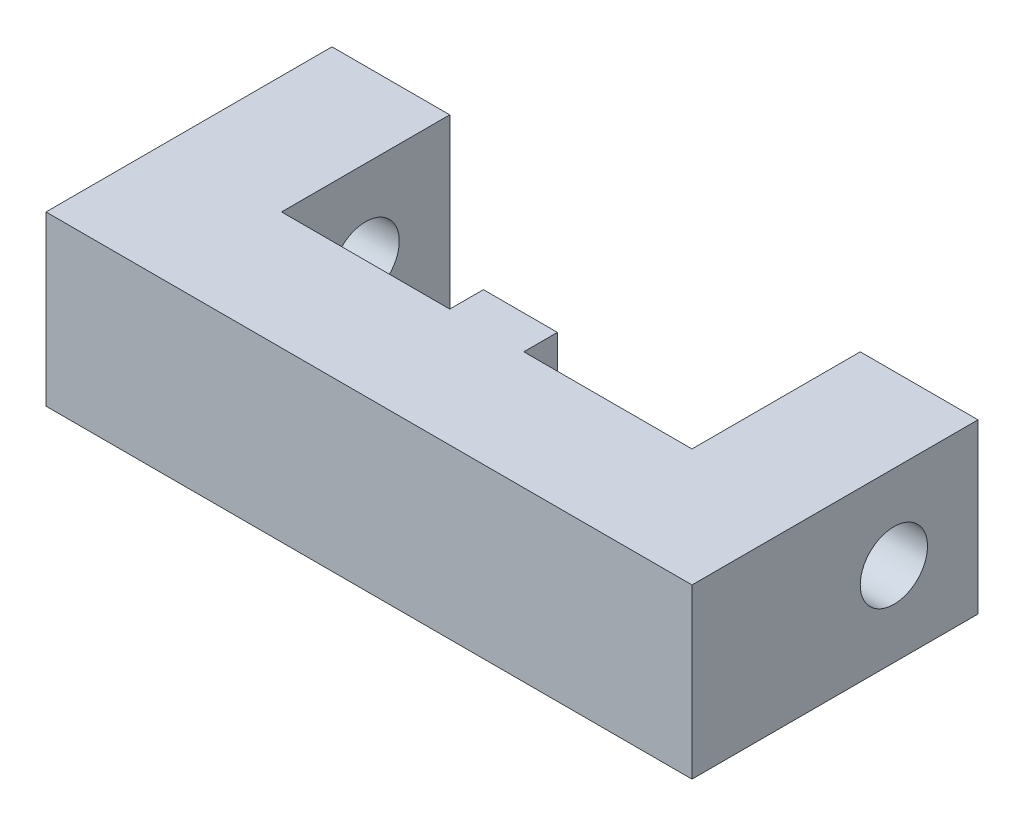
ISO-10303-21;
HEADER;
FILE_DESCRIPTION(('STEP AP214'),'2;1');
FILE_NAME('part.step','',(''),(''),'','','');
FILE_SCHEMA(('AUTOMOTIVE_DESIGN { 1 0 10303 214 1 1 1 1 }'));
ENDSEC;
DATA;
#1=APPLICATION_CONTEXT('core data for automotive mechanical design processes');
#2=APPLICATION_PROTOCOL_DEFINITION('international standard','automotive_design',2000,#1);
#3=PRODUCT_CONTEXT('',#1,'mechanical');
#4=PRODUCT('Part','Part','',(#3));
#5=PRODUCT_RELATED_PRODUCT_CATEGORY('part','',(#4));
#6=PRODUCT_DEFINITION_FORMATION('','',#4);
#7=PRODUCT_DEFINITION_CONTEXT('part definition',#1,'design');
#8=PRODUCT_DEFINITION('design','',#6,#7);
#9=PRODUCT_DEFINITION_SHAPE('','',#8);
#10=(LENGTH_UNIT() NAMED_UNIT(*) SI_UNIT(.MILLI.,.METRE.));
#11=(NAMED_UNIT(*) PLANE_ANGLE_UNIT() SI_UNIT($,.RADIAN.));
#12=(NAMED_UNIT(*) SI_UNIT($,.STERADIAN.) SOLID_ANGLE_UNIT());
#13=UNCERTAINTY_MEASURE_WITH_UNIT(LENGTH_MEASURE(1.E-05),#10,'distance_accuracy_value','');
#14=(GEOMETRIC_REPRESENTATION_CONTEXT(3) GLOBAL_UNCERTAINTY_ASSIGNED_CONTEXT((#13)) GLOBAL_UNIT_ASSIGNED_CONTEXT((#10,
#11,#12)) REPRESENTATION_CONTEXT('',''));
#15=CARTESIAN_POINT('',(0.,0.,0.));
#16=DIRECTION('',(0.,0.,1.));
#17=DIRECTION('',(1.,0.,0.));
#18=AXIS2_PLACEMENT_3D('',#15,#16,#17);
#19=CARTESIAN_POINT('',(0.,12.7,0.));
#20=DIRECTION('',(1.,0.,0.));
#21=DIRECTION('',(0.,0.,-1.));
#22=AXIS2_PLACEMENT_3D('',#19,#20,#21);
#23=PLANE('',#22);
#24=CARTESIAN_POINT('',(0.,6.35,-15.24));
#25=DIRECTION('',(1.,0.,0.));
#26=DIRECTION('',(0.,0.,-1.));
#27=AXIS2_PLACEMENT_3D('',#24,#25,#26);
#28=CIRCLE('',#27,2.54);
#29=CARTESIAN_POINT('',(0.,6.35,-17.78));
#30=VERTEX_POINT('',#29);
#31=EDGE_CURVE('E209',#30,#30,#28,.T.);
#32=ORIENTED_EDGE('',*,*,#31,.T.);
#33=EDGE_LOOP('',(#32));
#34=FACE_BOUND('',#33,.T.);
#35=DIRECTION('',(0.,0.,1.));
#36=VECTOR('',#35,1.);
#37=CARTESIAN_POINT('',(0.,0.,0.));
#38=LINE('',#37,#36);
#39=CARTESIAN_POINT('',(0.,0.,-21.59));
#40=VERTEX_POINT('',#39);
#41=CARTESIAN_POINT('',(0.,0.,0.));
#42=VERTEX_POINT('',#41);
#43=EDGE_CURVE('E140',#40,#42,#38,.T.);
#44=ORIENTED_EDGE('',*,*,#43,.T.);
#45=DIRECTION('',(0.,-1.,0.));
#46=VECTOR('',#45,1.);
#47=CARTESIAN_POINT('',(0.,12.7,0.));
#48=LINE('',#47,#46);
#49=CARTESIAN_POINT('',(0.,12.7,0.));
#50=VERTEX_POINT('',#49);
#51=EDGE_CURVE('E11',#50,#42,#48,.T.);
#52=ORIENTED_EDGE('',*,*,#51,.F.);
#53=DIRECTION('',(0.,0.,1.));
#54=VECTOR('',#53,1.);
#55=CARTESIAN_POINT('',(0.,12.7,0.));
#56=LINE('',#55,#54);
#57=CARTESIAN_POINT('',(0.,12.7,-21.59));
#58=VERTEX_POINT('',#57);
#59=EDGE_CURVE('E161',#58,#50,#56,.T.);
#60=ORIENTED_EDGE('',*,*,#59,.F.);
#61=DIRECTION('',(0.,-1.,0.));
#62=VECTOR('',#61,1.);
#63=CARTESIAN_POINT('',(0.,12.7,-21.59));
#64=LINE('',#63,#62);
#65=EDGE_CURVE('E136',#58,#40,#64,.T.);
#66=ORIENTED_EDGE('',*,*,#65,.T.);
#67=EDGE_LOOP('',(#44,#52,#60,#66));
#68=FACE_BOUND('',#67,.T.);
#69=ADVANCED_FACE('F45',(#34,#68),#23,.F.);
#70=CARTESIAN_POINT('',(0.,12.7,0.));
#71=DIRECTION('',(0.,0.,-1.));
#72=DIRECTION('',(-1.,0.,0.));
#73=AXIS2_PLACEMENT_3D('',#70,#71,#72);
#74=PLANE('',#73);
#75=DIRECTION('',(1.,0.,0.));
#76=VECTOR('',#75,1.);
#77=CARTESIAN_POINT('',(0.,0.,0.));
#78=LINE('',#77,#76);
#79=CARTESIAN_POINT('',(48.768,0.,0.));
#80=VERTEX_POINT('',#79);
#81=EDGE_CURVE('E144',#42,#80,#78,.T.);
#82=ORIENTED_EDGE('',*,*,#81,.T.);
#83=DIRECTION('',(0.,-1.,0.));
#84=VECTOR('',#83,1.);
#85=CARTESIAN_POINT('',(48.768,12.7,0.));
#86=LINE('',#85,#84);
#87=CARTESIAN_POINT('',(48.768,12.7,0.));
#88=VERTEX_POINT('',#87);
#89=EDGE_CURVE('E243',#88,#80,#86,.T.);
#90=ORIENTED_EDGE('',*,*,#89,.F.);
#91=DIRECTION('',(1.,0.,0.));
#92=VECTOR('',#91,1.);
#93=CARTESIAN_POINT('',(0.,12.7,0.));
#94=LINE('',#93,#92);
#95=EDGE_CURVE('E101',#50,#88,#94,.T.);
#96=ORIENTED_EDGE('',*,*,#95,.F.);
#97=ORIENTED_EDGE('',*,*,#51,.T.);
#98=EDGE_LOOP('',(#82,#90,#96,#97));
#99=FACE_BOUND('',#98,.T.);
#100=ADVANCED_FACE('F201',(#99),#74,.F.);
#101=CARTESIAN_POINT('',(21.59,12.7,-11.43));
#102=DIRECTION('',(0.,0.,1.));
#103=DIRECTION('',(1.,0.,0.));
#104=AXIS2_PLACEMENT_3D('',#101,#102,#103);
#105=PLANE('',#104);
#106=DIRECTION('',(-1.,0.,0.));
#107=VECTOR('',#106,1.);
#108=CARTESIAN_POINT('',(21.59,0.,-11.43));
#109=LINE('',#108,#107);
#110=CARTESIAN_POINT('',(27.178,0.,-11.43));
#111=VERTEX_POINT('',#110);
#112=CARTESIAN_POINT('',(21.59,0.,-11.43));
#113=VERTEX_POINT('',#112);
#114=EDGE_CURVE('E149',#111,#113,#109,.T.);
#115=ORIENTED_EDGE('',*,*,#114,.T.);
#116=DIRECTION('',(0.,-1.,0.));
#117=VECTOR('',#116,1.);
#118=CARTESIAN_POINT('',(21.59,12.7,-11.43));
#119=LINE('',#118,#117);
#120=CARTESIAN_POINT('',(21.59,12.7,-11.43));
#121=VERTEX_POINT('',#120);
#122=EDGE_CURVE('E55',#121,#113,#119,.T.);
#123=ORIENTED_EDGE('',*,*,#122,.F.);
#124=DIRECTION('',(-1.,0.,0.));
#125=VECTOR('',#124,1.);
#126=CARTESIAN_POINT('',(21.59,12.7,-11.43));
#127=LINE('',#126,#125);
#128=CARTESIAN_POINT('',(27.178,12.7,-11.43));
#129=VERTEX_POINT('',#128);
#130=EDGE_CURVE('E283',#129,#121,#127,.T.);
#131=ORIENTED_EDGE('',*,*,#130,.F.);
#132=DIRECTION('',(0.,-1.,0.));
#133=VECTOR('',#132,1.);
#134=CARTESIAN_POINT('',(27.178,12.7,-11.43));
#135=LINE('',#134,#133);
#136=EDGE_CURVE('E261',#129,#111,#135,.T.);
#137=ORIENTED_EDGE('',*,*,#136,.T.);
#138=EDGE_LOOP('',(#115,#123,#131,#137));
#139=FACE_BOUND('',#138,.T.);
#140=ADVANCED_FACE('F206',(#139),#105,.F.);
#141=CARTESIAN_POINT('',(21.59,12.7,-8.89));
#142=DIRECTION('',(1.,0.,0.));
#143=DIRECTION('',(0.,0.,-1.));
#144=AXIS2_PLACEMENT_3D('',#141,#142,#143);
#145=PLANE('',#144);
#146=DIRECTION('',(0.,0.,1.));
#147=VECTOR('',#146,1.);
#148=CARTESIAN_POINT('',(21.59,0.,-8.89));
#149=LINE('',#148,#147);
#150=CARTESIAN_POINT('',(21.59,0.,-8.89));
#151=VERTEX_POINT('',#150);
#152=EDGE_CURVE('E152',#113,#151,#149,.T.);
#153=ORIENTED_EDGE('',*,*,#152,.T.);
#154=DIRECTION('',(0.,-1.,0.));
#155=VECTOR('',#154,1.);
#156=CARTESIAN_POINT('',(21.59,12.7,-8.89));
#157=LINE('',#156,#155);
#158=CARTESIAN_POINT('',(21.59,12.7,-8.89));
#159=VERTEX_POINT('',#158);
#160=EDGE_CURVE('E129',#159,#151,#157,.T.);
#161=ORIENTED_EDGE('',*,*,#160,.F.);
#162=DIRECTION('',(0.,0.,1.));
#163=VECTOR('',#162,1.);
#164=CARTESIAN_POINT('',(21.59,12.7,-8.89));
#165=LINE('',#164,#163);
#166=EDGE_CURVE('E118',#121,#159,#165,.T.);
#167=ORIENTED_EDGE('',*,*,#166,.F.);
#168=ORIENTED_EDGE('',*,*,#122,.T.);
#169=EDGE_LOOP('',(#153,#161,#167,#168));
#170=FACE_BOUND('',#169,.T.);
#171=ADVANCED_FACE('F173',(#170),#145,.F.);
#172=CARTESIAN_POINT('',(8.89,12.7,-8.89));
#173=DIRECTION('',(0.,0.,1.));
#174=DIRECTION('',(1.,0.,0.));
#175=AXIS2_PLACEMENT_3D('',#172,#173,#174);
#176=PLANE('',#175);
#177=DIRECTION('',(-1.,0.,0.));
#178=VECTOR('',#177,1.);
#179=CARTESIAN_POINT('',(8.89,0.,-8.89));
#180=LINE('',#179,#178);
#181=CARTESIAN_POINT('',(8.89,0.,-8.89));
#182=VERTEX_POINT('',#181);
#183=EDGE_CURVE('E127',#151,#182,#180,.T.);
#184=ORIENTED_EDGE('',*,*,#183,.T.);
#185=DIRECTION('',(0.,-1.,0.));
#186=VECTOR('',#185,1.);
#187=CARTESIAN_POINT('',(8.89,12.7,-8.89));
#188=LINE('',#187,#186);
#189=CARTESIAN_POINT('',(8.89,12.7,-8.89));
#190=VERTEX_POINT('',#189);
#191=EDGE_CURVE('E124',#190,#182,#188,.T.);
#192=ORIENTED_EDGE('',*,*,#191,.F.);
#193=DIRECTION('',(-1.,0.,0.));
#194=VECTOR('',#193,1.);
#195=CARTESIAN_POINT('',(8.89,12.7,-8.89));
#196=LINE('',#195,#194);
#197=EDGE_CURVE('E112',#159,#190,#196,.T.);
#198=ORIENTED_EDGE('',*,*,#197,.F.);
#199=ORIENTED_EDGE('',*,*,#160,.T.);
#200=EDGE_LOOP('',(#184,#192,#198,#199));
#201=FACE_BOUND('',#200,.T.);
#202=ADVANCED_FACE('F125',(#201),#176,.F.);
#203=CARTESIAN_POINT('',(8.89,12.7,-21.59));
#204=DIRECTION('',(-1.,0.,0.));
#205=DIRECTION('',(0.,0.,1.));
#206=AXIS2_PLACEMENT_3D('',#203,#204,#205);
#207=PLANE('',#206);
#208=CARTESIAN_POINT('',(8.89,6.35,-15.24));
#209=DIRECTION('',(-1.,0.,0.));
#210=DIRECTION('',(0.,0.,1.));
#211=AXIS2_PLACEMENT_3D('',#208,#209,#210);
#212=CIRCLE('',#211,2.54);
#213=CARTESIAN_POINT('',(8.89,6.35,-12.7));
#214=VERTEX_POINT('',#213);
#215=EDGE_CURVE('E213',#214,#214,#212,.T.);
#216=ORIENTED_EDGE('',*,*,#215,.T.);
#217=EDGE_LOOP('',(#216));
#218=FACE_BOUND('',#217,.T.);
#219=DIRECTION('',(0.,0.,-1.));
#220=VECTOR('',#219,1.);
#221=CARTESIAN_POINT('',(8.89,0.,-21.59));
#222=LINE('',#221,#220);
#223=CARTESIAN_POINT('',(8.89,0.,-21.59));
#224=VERTEX_POINT('',#223);
#225=EDGE_CURVE('E87',#182,#224,#222,.T.);
#226=ORIENTED_EDGE('',*,*,#225,.T.);
#227=DIRECTION('',(0.,-1.,0.));
#228=VECTOR('',#227,1.);
#229=CARTESIAN_POINT('',(8.89,12.7,-21.59));
#230=LINE('',#229,#228);
#231=CARTESIAN_POINT('',(8.89,12.7,-21.59));
#232=VERTEX_POINT('',#231);
#233=EDGE_CURVE('E130',#232,#224,#230,.T.);
#234=ORIENTED_EDGE('',*,*,#233,.F.);
#235=DIRECTION('',(0.,0.,-1.));
#236=VECTOR('',#235,1.);
#237=CARTESIAN_POINT('',(8.89,12.7,-21.59));
#238=LINE('',#237,#236);
#239=EDGE_CURVE('E116',#190,#232,#238,.T.);
#240=ORIENTED_EDGE('',*,*,#239,.F.);
#241=ORIENTED_EDGE('',*,*,#191,.T.);
#242=EDGE_LOOP('',(#226,#234,#240,#241));
#243=FACE_BOUND('',#242,.T.);
#244=ADVANCED_FACE('F132',(#218,#243),#207,.F.);
#245=CARTESIAN_POINT('',(0.,12.7,-21.59));
#246=DIRECTION('',(0.,0.,1.));
#247=DIRECTION('',(1.,0.,0.));
#248=AXIS2_PLACEMENT_3D('',#245,#246,#247);
#249=PLANE('',#248);
#250=DIRECTION('',(-1.,0.,0.));
#251=VECTOR('',#250,1.);
#252=CARTESIAN_POINT('',(0.,0.,-21.59));
#253=LINE('',#252,#251);
#254=EDGE_CURVE('E93',#224,#40,#253,.T.);
#255=ORIENTED_EDGE('',*,*,#254,.T.);
#256=ORIENTED_EDGE('',*,*,#65,.F.);
#257=DIRECTION('',(-1.,0.,0.));
#258=VECTOR('',#257,1.);
#259=CARTESIAN_POINT('',(0.,12.7,-21.59));
#260=LINE('',#259,#258);
#261=EDGE_CURVE('E63',#232,#58,#260,.T.);
#262=ORIENTED_EDGE('',*,*,#261,.F.);
#263=ORIENTED_EDGE('',*,*,#233,.T.);
#264=EDGE_LOOP('',(#255,#256,#262,#263));
#265=FACE_BOUND('',#264,.T.);
#266=ADVANCED_FACE('F187',(#265),#249,.F.);
#267=CARTESIAN_POINT('',(0.,12.7,0.));
#268=DIRECTION('',(0.,-1.,0.));
#269=DIRECTION('',(0.,0.,-1.));
#270=AXIS2_PLACEMENT_3D('',#267,#268,#269);
#271=PLANE('',#270);
#272=ORIENTED_EDGE('',*,*,#59,.T.);
#273=ORIENTED_EDGE('',*,*,#95,.T.);
#274=DIRECTION('',(0.,0.,1.));
#275=VECTOR('',#274,1.);
#276=CARTESIAN_POINT('',(48.768,12.7,0.));
#277=LINE('',#276,#275);
#278=CARTESIAN_POINT('',(48.768,12.7,-21.59));
#279=VERTEX_POINT('',#278);
#280=EDGE_CURVE('E223',#279,#88,#277,.T.);
#281=ORIENTED_EDGE('',*,*,#280,.F.);
#282=DIRECTION('',(1.,0.,0.));
#283=VECTOR('',#282,1.);
#284=CARTESIAN_POINT('',(48.768,12.7,-21.59));
#285=LINE('',#284,#283);
#286=CARTESIAN_POINT('',(39.878,12.7,-21.59));
#287=VERTEX_POINT('',#286);
#288=EDGE_CURVE('E227',#287,#279,#285,.T.);
#289=ORIENTED_EDGE('',*,*,#288,.F.);
#290=DIRECTION('',(0.,0.,-1.));
#291=VECTOR('',#290,1.);
#292=CARTESIAN_POINT('',(39.878,12.7,-21.59));
#293=LINE('',#292,#291);
#294=CARTESIAN_POINT('',(39.878,12.7,-8.89000000000001));
#295=VERTEX_POINT('',#294);
#296=EDGE_CURVE('E232',#295,#287,#293,.T.);
#297=ORIENTED_EDGE('',*,*,#296,.F.);
#298=DIRECTION('',(1.,0.,0.));
#299=VECTOR('',#298,1.);
#300=CARTESIAN_POINT('',(39.878,12.7,-8.89000000000001));
#301=LINE('',#300,#299);
#302=CARTESIAN_POINT('',(27.178,12.7,-8.89));
#303=VERTEX_POINT('',#302);
#304=EDGE_CURVE('E236',#303,#295,#301,.T.);
#305=ORIENTED_EDGE('',*,*,#304,.F.);
#306=DIRECTION('',(0.,0.,1.));
#307=VECTOR('',#306,1.);
#308=CARTESIAN_POINT('',(27.178,12.7,-8.89));
#309=LINE('',#308,#307);
#310=EDGE_CURVE('E240',#129,#303,#309,.T.);
#311=ORIENTED_EDGE('',*,*,#310,.F.);
#312=ORIENTED_EDGE('',*,*,#130,.T.);
#313=ORIENTED_EDGE('',*,*,#166,.T.);
#314=ORIENTED_EDGE('',*,*,#197,.T.);
#315=ORIENTED_EDGE('',*,*,#239,.T.);
#316=ORIENTED_EDGE('',*,*,#261,.T.);
#317=EDGE_LOOP('',(#272,#273,#281,#289,#297,#305,#311,#312,#313,#314,#315,#316));
#318=FACE_BOUND('',#317,.T.);
#319=ADVANCED_FACE('F114',(#318),#271,.F.);
#320=CARTESIAN_POINT('',(0.,0.,0.));
#321=DIRECTION('',(0.,-1.,0.));
#322=DIRECTION('',(0.,0.,-1.));
#323=AXIS2_PLACEMENT_3D('',#320,#321,#322);
#324=PLANE('',#323);
#325=ORIENTED_EDGE('',*,*,#43,.F.);
#326=ORIENTED_EDGE('',*,*,#254,.F.);
#327=ORIENTED_EDGE('',*,*,#225,.F.);
#328=ORIENTED_EDGE('',*,*,#183,.F.);
#329=ORIENTED_EDGE('',*,*,#152,.F.);
#330=ORIENTED_EDGE('',*,*,#114,.F.);
#331=DIRECTION('',(0.,0.,1.));
#332=VECTOR('',#331,1.);
#333=CARTESIAN_POINT('',(27.178,0.,-8.89));
#334=LINE('',#333,#332);
#335=CARTESIAN_POINT('',(27.178,0.,-8.89));
#336=VERTEX_POINT('',#335);
#337=EDGE_CURVE('E228',#111,#336,#334,.T.);
#338=ORIENTED_EDGE('',*,*,#337,.T.);
#339=DIRECTION('',(1.,0.,0.));
#340=VECTOR('',#339,1.);
#341=CARTESIAN_POINT('',(39.878,0.,-8.89000000000001));
#342=LINE('',#341,#340);
#343=CARTESIAN_POINT('',(39.878,0.,-8.89000000000001));
#344=VERTEX_POINT('',#343);
#345=EDGE_CURVE('E252',#336,#344,#342,.T.);
#346=ORIENTED_EDGE('',*,*,#345,.T.);
#347=DIRECTION('',(0.,0.,-1.));
#348=VECTOR('',#347,1.);
#349=CARTESIAN_POINT('',(39.878,0.,-21.59));
#350=LINE('',#349,#348);
#351=CARTESIAN_POINT('',(39.878,0.,-21.59));
#352=VERTEX_POINT('',#351);
#353=EDGE_CURVE('E248',#344,#352,#350,.T.);
#354=ORIENTED_EDGE('',*,*,#353,.T.);
#355=DIRECTION('',(1.,0.,0.));
#356=VECTOR('',#355,1.);
#357=CARTESIAN_POINT('',(48.768,0.,-21.59));
#358=LINE('',#357,#356);
#359=CARTESIAN_POINT('',(48.768,0.,-21.59));
#360=VERTEX_POINT('',#359);
#361=EDGE_CURVE('E217',#352,#360,#358,.T.);
#362=ORIENTED_EDGE('',*,*,#361,.T.);
#363=DIRECTION('',(0.,0.,1.));
#364=VECTOR('',#363,1.);
#365=CARTESIAN_POINT('',(48.768,0.,0.));
#366=LINE('',#365,#364);
#367=EDGE_CURVE('E212',#360,#80,#366,.T.);
#368=ORIENTED_EDGE('',*,*,#367,.T.);
#369=ORIENTED_EDGE('',*,*,#81,.F.);
#370=EDGE_LOOP('',(#325,#326,#327,#328,#329,#330,#338,#346,#354,#362,#368,#369));
#371=FACE_BOUND('',#370,.T.);
#372=ADVANCED_FACE('F179',(#371),#324,.T.);
#373=CARTESIAN_POINT('',(48.768,12.7,0.));
#374=DIRECTION('',(1.,0.,0.));
#375=DIRECTION('',(0.,0.,-1.));
#376=AXIS2_PLACEMENT_3D('',#373,#374,#375);
#377=PLANE('',#376);
#378=CARTESIAN_POINT('',(48.768,6.35,-15.24));
#379=DIRECTION('',(-1.,0.,0.));
#380=DIRECTION('',(0.,0.,1.));
#381=AXIS2_PLACEMENT_3D('',#378,#379,#380);
#382=CIRCLE('',#381,2.54);
#383=CARTESIAN_POINT('',(48.768,6.35,-12.7));
#384=VERTEX_POINT('',#383);
#385=EDGE_CURVE('E403',#384,#384,#382,.T.);
#386=ORIENTED_EDGE('',*,*,#385,.T.);
#387=EDGE_LOOP('',(#386));
#388=FACE_BOUND('',#387,.T.);
#389=ORIENTED_EDGE('',*,*,#367,.F.);
#390=DIRECTION('',(0.,-1.,0.));
#391=VECTOR('',#390,1.);
#392=CARTESIAN_POINT('',(48.768,12.7,-21.59));
#393=LINE('',#392,#391);
#394=EDGE_CURVE('E145',#279,#360,#393,.T.);
#395=ORIENTED_EDGE('',*,*,#394,.F.);
#396=ORIENTED_EDGE('',*,*,#280,.T.);
#397=ORIENTED_EDGE('',*,*,#89,.T.);
#398=EDGE_LOOP('',(#389,#395,#396,#397));
#399=FACE_BOUND('',#398,.T.);
#400=ADVANCED_FACE('F319',(#388,#399),#377,.T.);
#401=CARTESIAN_POINT('',(48.768,12.7,-21.59));
#402=DIRECTION('',(0.,0.,-1.));
#403=DIRECTION('',(-1.,0.,0.));
#404=AXIS2_PLACEMENT_3D('',#401,#402,#403);
#405=PLANE('',#404);
#406=ORIENTED_EDGE('',*,*,#361,.F.);
#407=DIRECTION('',(0.,-1.,0.));
#408=VECTOR('',#407,1.);
#409=CARTESIAN_POINT('',(39.878,12.7,-21.59));
#410=LINE('',#409,#408);
#411=EDGE_CURVE('E272',#287,#352,#410,.T.);
#412=ORIENTED_EDGE('',*,*,#411,.F.);
#413=ORIENTED_EDGE('',*,*,#288,.T.);
#414=ORIENTED_EDGE('',*,*,#394,.T.);
#415=EDGE_LOOP('',(#406,#412,#413,#414));
#416=FACE_BOUND('',#415,.T.);
#417=ADVANCED_FACE('F323',(#416),#405,.T.);
#418=CARTESIAN_POINT('',(39.878,12.7,-21.59));
#419=DIRECTION('',(-1.,0.,0.));
#420=DIRECTION('',(0.,0.,1.));
#421=AXIS2_PLACEMENT_3D('',#418,#419,#420);
#422=PLANE('',#421);
#423=CARTESIAN_POINT('',(39.878,6.35,-15.24));
#424=DIRECTION('',(-1.,0.,0.));
#425=DIRECTION('',(0.,0.,1.));
#426=AXIS2_PLACEMENT_3D('',#423,#424,#425);
#427=CIRCLE('',#426,2.54);
#428=CARTESIAN_POINT('',(39.878,6.35,-12.7));
#429=VERTEX_POINT('',#428);
#430=EDGE_CURVE('E48',#429,#429,#427,.T.);
#431=ORIENTED_EDGE('',*,*,#430,.F.);
#432=EDGE_LOOP('',(#431));
#433=FACE_BOUND('',#432,.T.);
#434=ORIENTED_EDGE('',*,*,#353,.F.);
#435=DIRECTION('',(0.,-1.,0.));
#436=VECTOR('',#435,1.);
#437=CARTESIAN_POINT('',(39.878,12.7,-8.89000000000001));
#438=LINE('',#437,#436);
#439=EDGE_CURVE('E268',#295,#344,#438,.T.);
#440=ORIENTED_EDGE('',*,*,#439,.F.);
#441=ORIENTED_EDGE('',*,*,#296,.T.);
#442=ORIENTED_EDGE('',*,*,#411,.T.);
#443=EDGE_LOOP('',(#434,#440,#441,#442));
#444=FACE_BOUND('',#443,.T.);
#445=ADVANCED_FACE('F327',(#433,#444),#422,.T.);
#446=CARTESIAN_POINT('',(39.878,12.7,-8.89000000000001));
#447=DIRECTION('',(0.,0.,-1.));
#448=DIRECTION('',(-1.,0.,0.));
#449=AXIS2_PLACEMENT_3D('',#446,#447,#448);
#450=PLANE('',#449);
#451=ORIENTED_EDGE('',*,*,#345,.F.);
#452=DIRECTION('',(0.,-1.,0.));
#453=VECTOR('',#452,1.);
#454=CARTESIAN_POINT('',(27.178,12.7,-8.89));
#455=LINE('',#454,#453);
#456=EDGE_CURVE('E264',#303,#336,#455,.T.);
#457=ORIENTED_EDGE('',*,*,#456,.F.);
#458=ORIENTED_EDGE('',*,*,#304,.T.);
#459=ORIENTED_EDGE('',*,*,#439,.T.);
#460=EDGE_LOOP('',(#451,#457,#458,#459));
#461=FACE_BOUND('',#460,.T.);
#462=ADVANCED_FACE('F329',(#461),#450,.T.);
#463=CARTESIAN_POINT('',(27.178,12.7,-8.89));
#464=DIRECTION('',(1.,0.,0.));
#465=DIRECTION('',(0.,0.,-1.));
#466=AXIS2_PLACEMENT_3D('',#463,#464,#465);
#467=PLANE('',#466);
#468=ORIENTED_EDGE('',*,*,#337,.F.);
#469=ORIENTED_EDGE('',*,*,#136,.F.);
#470=ORIENTED_EDGE('',*,*,#310,.T.);
#471=ORIENTED_EDGE('',*,*,#456,.T.);
#472=EDGE_LOOP('',(#468,#469,#470,#471));
#473=FACE_BOUND('',#472,.T.);
#474=ADVANCED_FACE('F294',(#473),#467,.T.);
#475=CARTESIAN_POINT('',(48.768,6.35,-15.24));
#476=DIRECTION('',(-1.,0.,0.));
#477=DIRECTION('',(0.,0.,1.));
#478=AXIS2_PLACEMENT_3D('',#475,#476,#477);
#479=CYLINDRICAL_SURFACE('',#478,2.54);
#480=ORIENTED_EDGE('',*,*,#430,.T.);
#481=EDGE_LOOP('',(#480));
#482=FACE_BOUND('',#481,.T.);
#483=ORIENTED_EDGE('',*,*,#385,.F.);
#484=EDGE_LOOP('',(#483));
#485=FACE_BOUND('',#484,.T.);
#486=ADVANCED_FACE('F335',(#482,#485),#479,.F.);
#487=ORIENTED_EDGE('',*,*,#215,.F.);
#488=EDGE_LOOP('',(#487));
#489=FACE_BOUND('',#488,.T.);
#490=ORIENTED_EDGE('',*,*,#31,.F.);
#491=EDGE_LOOP('',(#490));
#492=FACE_BOUND('',#491,.T.);
#493=ADVANCED_FACE('F386',(#489,#492),#479,.F.);
#494=CLOSED_SHELL('',(#69,#100,#140,#171,#202,#244,#266,#319,#372,#400,#417,#445,#462,#474,#486,#493));
#495=MANIFOLD_SOLID_BREP('B2',#494);
#496=ADVANCED_BREP_SHAPE_REPRESENTATION('',(#18,#495),#14);
#497=SHAPE_DEFINITION_REPRESENTATION(#9,#496);
ENDSEC;
END-ISO-10303-21;
